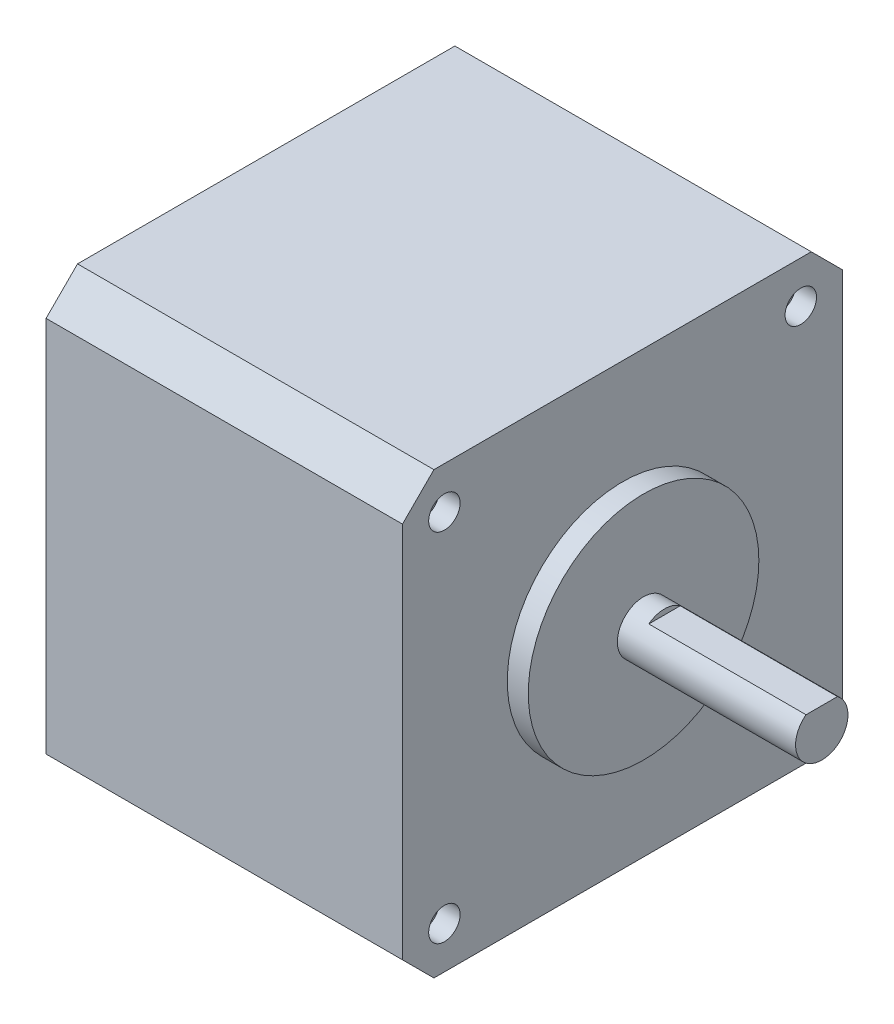
ISO-10303-21;
HEADER;
FILE_DESCRIPTION(('STEP AP214'),'2;1');
FILE_NAME('part.step','',(''),(''),'','','');
FILE_SCHEMA(('AUTOMOTIVE_DESIGN { 1 0 10303 214 1 1 1 1 }'));
ENDSEC;
DATA;
#1=APPLICATION_CONTEXT('core data for automotive mechanical design processes');
#2=APPLICATION_PROTOCOL_DEFINITION('international standard','automotive_design',2000,#1);
#3=PRODUCT_CONTEXT('',#1,'mechanical');
#4=PRODUCT('Part','Part','',(#3));
#5=PRODUCT_RELATED_PRODUCT_CATEGORY('part','',(#4));
#6=PRODUCT_DEFINITION_FORMATION('','',#4);
#7=PRODUCT_DEFINITION_CONTEXT('part definition',#1,'design');
#8=PRODUCT_DEFINITION('design','',#6,#7);
#9=PRODUCT_DEFINITION_SHAPE('','',#8);
#10=(LENGTH_UNIT() NAMED_UNIT(*) SI_UNIT(.MILLI.,.METRE.));
#11=(NAMED_UNIT(*) PLANE_ANGLE_UNIT() SI_UNIT($,.RADIAN.));
#12=(NAMED_UNIT(*) SI_UNIT($,.STERADIAN.) SOLID_ANGLE_UNIT());
#13=UNCERTAINTY_MEASURE_WITH_UNIT(LENGTH_MEASURE(1.E-05),#10,'distance_accuracy_value','');
#14=(GEOMETRIC_REPRESENTATION_CONTEXT(3) GLOBAL_UNCERTAINTY_ASSIGNED_CONTEXT((#13)) GLOBAL_UNIT_ASSIGNED_CONTEXT((#10,
#11,#12)) REPRESENTATION_CONTEXT('',''));
#15=CARTESIAN_POINT('',(0.,0.,0.));
#16=DIRECTION('',(0.,0.,1.));
#17=DIRECTION('',(1.,0.,0.));
#18=AXIS2_PLACEMENT_3D('',#15,#16,#17);
#19=CARTESIAN_POINT('',(-17.,42.,21.));
#20=DIRECTION('',(1.,0.,0.));
#21=DIRECTION('',(0.,0.,-1.));
#22=AXIS2_PLACEMENT_3D('',#19,#20,#21);
#23=PLANE('',#22);
#24=CARTESIAN_POINT('',(-17.,38.0000000000001,-17.));
#25=DIRECTION('',(1.,0.,0.));
#26=DIRECTION('',(0.,0.,-1.));
#27=AXIS2_PLACEMENT_3D('',#24,#25,#26);
#28=CIRCLE('',#27,1.5);
#29=CARTESIAN_POINT('',(-17.,38.0000000000001,-18.5));
#30=VERTEX_POINT('',#29);
#31=EDGE_CURVE('E349',#30,#30,#28,.T.);
#32=ORIENTED_EDGE('',*,*,#31,.T.);
#33=EDGE_LOOP('',(#32));
#34=FACE_BOUND('',#33,.T.);
#35=CARTESIAN_POINT('',(-17.,4.00000000000013,-17.));
#36=DIRECTION('',(1.,0.,0.));
#37=DIRECTION('',(0.,0.,-1.));
#38=AXIS2_PLACEMENT_3D('',#35,#36,#37);
#39=CIRCLE('',#38,1.5);
#40=CARTESIAN_POINT('',(-17.,4.00000000000013,-18.5));
#41=VERTEX_POINT('',#40);
#42=EDGE_CURVE('E354',#41,#41,#39,.T.);
#43=ORIENTED_EDGE('',*,*,#42,.T.);
#44=EDGE_LOOP('',(#43));
#45=FACE_BOUND('',#44,.T.);
#46=CARTESIAN_POINT('',(-17.,4.00000000000013,17.));
#47=DIRECTION('',(1.,0.,0.));
#48=DIRECTION('',(0.,0.,-1.));
#49=AXIS2_PLACEMENT_3D('',#46,#47,#48);
#50=CIRCLE('',#49,1.5);
#51=CARTESIAN_POINT('',(-17.,4.00000000000013,15.5));
#52=VERTEX_POINT('',#51);
#53=EDGE_CURVE('E360',#52,#52,#50,.T.);
#54=ORIENTED_EDGE('',*,*,#53,.T.);
#55=EDGE_LOOP('',(#54));
#56=FACE_BOUND('',#55,.T.);
#57=CARTESIAN_POINT('',(-17.,38.0000000000001,17.));
#58=DIRECTION('',(1.,0.,0.));
#59=DIRECTION('',(0.,0.,-1.));
#60=AXIS2_PLACEMENT_3D('',#57,#58,#59);
#61=CIRCLE('',#60,1.5);
#62=CARTESIAN_POINT('',(-17.,38.0000000000001,15.5));
#63=VERTEX_POINT('',#62);
#64=EDGE_CURVE('E343',#63,#63,#61,.T.);
#65=ORIENTED_EDGE('',*,*,#64,.T.);
#66=EDGE_LOOP('',(#65));
#67=FACE_BOUND('',#66,.T.);
#68=DIRECTION('',(0.,0.,1.));
#69=VECTOR('',#68,1.);
#70=CARTESIAN_POINT('',(-17.,42.,21.));
#71=LINE('',#70,#69);
#72=CARTESIAN_POINT('',(-17.,42.,-18.));
#73=VERTEX_POINT('',#72);
#74=CARTESIAN_POINT('',(-17.,42.,18.));
#75=VERTEX_POINT('',#74);
#76=EDGE_CURVE('E161',#73,#75,#71,.T.);
#77=ORIENTED_EDGE('',*,*,#76,.F.);
#78=DIRECTION('',(0.,-0.707106781186549,-0.707106781186546));
#79=VECTOR('',#78,1.);
#80=CARTESIAN_POINT('',(-17.,42.,-18.));
#81=LINE('',#80,#79);
#82=CARTESIAN_POINT('',(-17.,39.,-21.));
#83=VERTEX_POINT('',#82);
#84=EDGE_CURVE('E193',#73,#83,#81,.T.);
#85=ORIENTED_EDGE('',*,*,#84,.T.);
#86=DIRECTION('',(0.,-1.,0.));
#87=VECTOR('',#86,1.);
#88=CARTESIAN_POINT('',(-17.,42.,-21.));
#89=LINE('',#88,#87);
#90=CARTESIAN_POINT('',(-17.,3.00000000000003,-21.));
#91=VERTEX_POINT('',#90);
#92=EDGE_CURVE('E168',#83,#91,#89,.T.);
#93=ORIENTED_EDGE('',*,*,#92,.T.);
#94=DIRECTION('',(0.,0.707106781186546,-0.707106781186549));
#95=VECTOR('',#94,1.);
#96=CARTESIAN_POINT('',(-17.,3.00000000000002,-21.));
#97=LINE('',#96,#95);
#98=CARTESIAN_POINT('',(-17.,0.,-18.));
#99=VERTEX_POINT('',#98);
#100=EDGE_CURVE('E191',#91,#99,#97,.F.);
#101=ORIENTED_EDGE('',*,*,#100,.T.);
#102=DIRECTION('',(0.,0.,1.));
#103=VECTOR('',#102,1.);
#104=CARTESIAN_POINT('',(-17.,0.,21.));
#105=LINE('',#104,#103);
#106=CARTESIAN_POINT('',(-17.,0.,18.));
#107=VERTEX_POINT('',#106);
#108=EDGE_CURVE('E157',#99,#107,#105,.T.);
#109=ORIENTED_EDGE('',*,*,#108,.T.);
#110=DIRECTION('',(0.,-0.707106781186546,-0.707106781186549));
#111=VECTOR('',#110,1.);
#112=CARTESIAN_POINT('',(-17.,3.00000000000002,21.));
#113=LINE('',#112,#111);
#114=CARTESIAN_POINT('',(-17.,3.00000000000003,21.));
#115=VERTEX_POINT('',#114);
#116=EDGE_CURVE('E189',#107,#115,#113,.F.);
#117=ORIENTED_EDGE('',*,*,#116,.T.);
#118=DIRECTION('',(0.,-1.,0.));
#119=VECTOR('',#118,1.);
#120=CARTESIAN_POINT('',(-17.,42.,21.));
#121=LINE('',#120,#119);
#122=CARTESIAN_POINT('',(-17.,39.,21.));
#123=VERTEX_POINT('',#122);
#124=EDGE_CURVE('E160',#123,#115,#121,.T.);
#125=ORIENTED_EDGE('',*,*,#124,.F.);
#126=DIRECTION('',(0.,0.707106781186549,-0.707106781186546));
#127=VECTOR('',#126,1.);
#128=CARTESIAN_POINT('',(-17.,42.,18.));
#129=LINE('',#128,#127);
#130=EDGE_CURVE('E187',#123,#75,#129,.T.);
#131=ORIENTED_EDGE('',*,*,#130,.T.);
#132=EDGE_LOOP('',(#77,#85,#93,#101,#109,#117,#125,#131));
#133=FACE_BOUND('',#132,.T.);
#134=ADVANCED_FACE('F45',(#34,#45,#56,#67,#133),#23,.F.);
#135=CARTESIAN_POINT('',(17.,42.,21.));
#136=DIRECTION('',(0.,0.,-1.));
#137=DIRECTION('',(-1.,0.,0.));
#138=AXIS2_PLACEMENT_3D('',#135,#136,#137);
#139=PLANE('',#138);
#140=ORIENTED_EDGE('',*,*,#124,.T.);
#141=DIRECTION('',(1.,0.,0.));
#142=VECTOR('',#141,1.);
#143=CARTESIAN_POINT('',(17.,3.00000000000002,21.));
#144=LINE('',#143,#142);
#145=CARTESIAN_POINT('',(17.,3.00000000000003,21.));
#146=VERTEX_POINT('',#145);
#147=EDGE_CURVE('E11',#115,#146,#144,.T.);
#148=ORIENTED_EDGE('',*,*,#147,.T.);
#149=DIRECTION('',(0.,-1.,0.));
#150=VECTOR('',#149,1.);
#151=CARTESIAN_POINT('',(17.,42.,21.));
#152=LINE('',#151,#150);
#153=CARTESIAN_POINT('',(17.,39.,21.));
#154=VERTEX_POINT('',#153);
#155=EDGE_CURVE('E178',#154,#146,#152,.T.);
#156=ORIENTED_EDGE('',*,*,#155,.F.);
#157=DIRECTION('',(-1.,0.,0.));
#158=VECTOR('',#157,1.);
#159=CARTESIAN_POINT('',(-17.,39.,21.));
#160=LINE('',#159,#158);
#161=EDGE_CURVE('E54',#154,#123,#160,.T.);
#162=ORIENTED_EDGE('',*,*,#161,.T.);
#163=EDGE_LOOP('',(#140,#148,#156,#162));
#164=FACE_BOUND('',#163,.T.);
#165=ADVANCED_FACE('F212',(#164),#139,.F.);
#166=CARTESIAN_POINT('',(17.,42.,21.));
#167=DIRECTION('',(-1.,0.,0.));
#168=DIRECTION('',(0.,0.,1.));
#169=AXIS2_PLACEMENT_3D('',#166,#167,#168);
#170=PLANE('',#169);
#171=CARTESIAN_POINT('',(17.,38.0000000000001,-17.));
#172=DIRECTION('',(1.,0.,0.));
#173=DIRECTION('',(0.,0.,-1.));
#174=AXIS2_PLACEMENT_3D('',#171,#172,#173);
#175=CIRCLE('',#174,1.5);
#176=CARTESIAN_POINT('',(17.,38.0000000000001,-18.5));
#177=VERTEX_POINT('',#176);
#178=EDGE_CURVE('E309',#177,#177,#175,.T.);
#179=ORIENTED_EDGE('',*,*,#178,.F.);
#180=EDGE_LOOP('',(#179));
#181=FACE_BOUND('',#180,.T.);
#182=CARTESIAN_POINT('',(17.,4.00000000000013,-17.));
#183=DIRECTION('',(1.,0.,0.));
#184=DIRECTION('',(0.,0.,-1.));
#185=AXIS2_PLACEMENT_3D('',#182,#183,#184);
#186=CIRCLE('',#185,1.5);
#187=CARTESIAN_POINT('',(17.,4.00000000000013,-18.5));
#188=VERTEX_POINT('',#187);
#189=EDGE_CURVE('E313',#188,#188,#186,.T.);
#190=ORIENTED_EDGE('',*,*,#189,.F.);
#191=EDGE_LOOP('',(#190));
#192=FACE_BOUND('',#191,.T.);
#193=CARTESIAN_POINT('',(17.,4.00000000000013,17.));
#194=DIRECTION('',(1.,0.,0.));
#195=DIRECTION('',(0.,0.,-1.));
#196=AXIS2_PLACEMENT_3D('',#193,#194,#195);
#197=CIRCLE('',#196,1.5);
#198=CARTESIAN_POINT('',(17.,4.00000000000013,15.5));
#199=VERTEX_POINT('',#198);
#200=EDGE_CURVE('E317',#199,#199,#197,.T.);
#201=ORIENTED_EDGE('',*,*,#200,.F.);
#202=EDGE_LOOP('',(#201));
#203=FACE_BOUND('',#202,.T.);
#204=CARTESIAN_POINT('',(17.,38.0000000000001,17.));
#205=DIRECTION('',(1.,0.,0.));
#206=DIRECTION('',(0.,0.,-1.));
#207=AXIS2_PLACEMENT_3D('',#204,#205,#206);
#208=CIRCLE('',#207,1.5);
#209=CARTESIAN_POINT('',(17.,38.0000000000001,15.5));
#210=VERTEX_POINT('',#209);
#211=EDGE_CURVE('E321',#210,#210,#208,.T.);
#212=ORIENTED_EDGE('',*,*,#211,.F.);
#213=EDGE_LOOP('',(#212));
#214=FACE_BOUND('',#213,.T.);
#215=CARTESIAN_POINT('',(17.,21.0000000000001,0.));
#216=DIRECTION('',(1.,0.,0.));
#217=DIRECTION('',(0.,0.,-1.));
#218=AXIS2_PLACEMENT_3D('',#215,#216,#217);
#219=CIRCLE('',#218,11.);
#220=CARTESIAN_POINT('',(17.,21.0000000000001,-11.));
#221=VERTEX_POINT('',#220);
#222=EDGE_CURVE('E154',#221,#221,#219,.T.);
#223=ORIENTED_EDGE('',*,*,#222,.F.);
#224=EDGE_LOOP('',(#223));
#225=FACE_BOUND('',#224,.T.);
#226=DIRECTION('',(0.,-1.,0.));
#227=VECTOR('',#226,1.);
#228=CARTESIAN_POINT('',(17.,42.,-21.));
#229=LINE('',#228,#227);
#230=CARTESIAN_POINT('',(17.,39.,-21.));
#231=VERTEX_POINT('',#230);
#232=CARTESIAN_POINT('',(17.,3.00000000000003,-21.));
#233=VERTEX_POINT('',#232);
#234=EDGE_CURVE('E175',#231,#233,#229,.T.);
#235=ORIENTED_EDGE('',*,*,#234,.F.);
#236=DIRECTION('',(0.,0.707106781186549,0.707106781186546));
#237=VECTOR('',#236,1.);
#238=CARTESIAN_POINT('',(17.,42.,-18.));
#239=LINE('',#238,#237);
#240=CARTESIAN_POINT('',(17.,42.,-18.));
#241=VERTEX_POINT('',#240);
#242=EDGE_CURVE('E204',#231,#241,#239,.T.);
#243=ORIENTED_EDGE('',*,*,#242,.T.);
#244=DIRECTION('',(0.,0.,-1.));
#245=VECTOR('',#244,1.);
#246=CARTESIAN_POINT('',(17.,42.,21.));
#247=LINE('',#246,#245);
#248=CARTESIAN_POINT('',(17.,42.,18.));
#249=VERTEX_POINT('',#248);
#250=EDGE_CURVE('E164',#249,#241,#247,.T.);
#251=ORIENTED_EDGE('',*,*,#250,.F.);
#252=DIRECTION('',(0.,-0.707106781186549,0.707106781186546));
#253=VECTOR('',#252,1.);
#254=CARTESIAN_POINT('',(17.,42.,18.));
#255=LINE('',#254,#253);
#256=EDGE_CURVE('E68',#249,#154,#255,.T.);
#257=ORIENTED_EDGE('',*,*,#256,.T.);
#258=ORIENTED_EDGE('',*,*,#155,.T.);
#259=DIRECTION('',(0.,0.707106781186546,0.707106781186549));
#260=VECTOR('',#259,1.);
#261=CARTESIAN_POINT('',(17.,3.00000000000002,21.));
#262=LINE('',#261,#260);
#263=CARTESIAN_POINT('',(17.,0.,18.));
#264=VERTEX_POINT('',#263);
#265=EDGE_CURVE('E61',#146,#264,#262,.F.);
#266=ORIENTED_EDGE('',*,*,#265,.T.);
#267=DIRECTION('',(0.,0.,-1.));
#268=VECTOR('',#267,1.);
#269=CARTESIAN_POINT('',(17.,0.,21.));
#270=LINE('',#269,#268);
#271=CARTESIAN_POINT('',(17.,0.,-18.));
#272=VERTEX_POINT('',#271);
#273=EDGE_CURVE('E165',#264,#272,#270,.T.);
#274=ORIENTED_EDGE('',*,*,#273,.T.);
#275=DIRECTION('',(0.,-0.707106781186546,0.707106781186549));
#276=VECTOR('',#275,1.);
#277=CARTESIAN_POINT('',(17.,3.00000000000002,-21.));
#278=LINE('',#277,#276);
#279=EDGE_CURVE('E202',#272,#233,#278,.F.);
#280=ORIENTED_EDGE('',*,*,#279,.T.);
#281=EDGE_LOOP('',(#235,#243,#251,#257,#258,#266,#274,#280));
#282=FACE_BOUND('',#281,.T.);
#283=ADVANCED_FACE('F223',(#181,#192,#203,#214,#225,#282),#170,.F.);
#284=CARTESIAN_POINT('',(17.,42.,-21.));
#285=DIRECTION('',(0.,0.,1.));
#286=DIRECTION('',(1.,0.,0.));
#287=AXIS2_PLACEMENT_3D('',#284,#285,#286);
#288=PLANE('',#287);
#289=ORIENTED_EDGE('',*,*,#92,.F.);
#290=DIRECTION('',(1.,0.,0.));
#291=VECTOR('',#290,1.);
#292=CARTESIAN_POINT('',(17.,39.,-21.));
#293=LINE('',#292,#291);
#294=EDGE_CURVE('E198',#83,#231,#293,.T.);
#295=ORIENTED_EDGE('',*,*,#294,.T.);
#296=ORIENTED_EDGE('',*,*,#234,.T.);
#297=DIRECTION('',(-1.,0.,0.));
#298=VECTOR('',#297,1.);
#299=CARTESIAN_POINT('',(17.,3.00000000000002,-21.));
#300=LINE('',#299,#298);
#301=EDGE_CURVE('E195',#233,#91,#300,.T.);
#302=ORIENTED_EDGE('',*,*,#301,.T.);
#303=EDGE_LOOP('',(#289,#295,#296,#302));
#304=FACE_BOUND('',#303,.T.);
#305=ADVANCED_FACE('F230',(#304),#288,.F.);
#306=CARTESIAN_POINT('',(0.,42.,0.));
#307=DIRECTION('',(0.,1.,0.));
#308=DIRECTION('',(0.,0.,1.));
#309=AXIS2_PLACEMENT_3D('',#306,#307,#308);
#310=PLANE('',#309);
#311=ORIENTED_EDGE('',*,*,#250,.T.);
#312=DIRECTION('',(-1.,0.,0.));
#313=VECTOR('',#312,1.);
#314=CARTESIAN_POINT('',(-17.,42.,-18.));
#315=LINE('',#314,#313);
#316=EDGE_CURVE('E184',#241,#73,#315,.T.);
#317=ORIENTED_EDGE('',*,*,#316,.T.);
#318=ORIENTED_EDGE('',*,*,#76,.T.);
#319=DIRECTION('',(1.,0.,0.));
#320=VECTOR('',#319,1.);
#321=CARTESIAN_POINT('',(17.,42.,18.));
#322=LINE('',#321,#320);
#323=EDGE_CURVE('E153',#75,#249,#322,.T.);
#324=ORIENTED_EDGE('',*,*,#323,.T.);
#325=EDGE_LOOP('',(#311,#317,#318,#324));
#326=FACE_BOUND('',#325,.T.);
#327=ADVANCED_FACE('F220',(#326),#310,.T.);
#328=CARTESIAN_POINT('',(0.,0.,0.));
#329=DIRECTION('',(0.,1.,0.));
#330=DIRECTION('',(0.,0.,1.));
#331=AXIS2_PLACEMENT_3D('',#328,#329,#330);
#332=PLANE('',#331);
#333=ORIENTED_EDGE('',*,*,#108,.F.);
#334=DIRECTION('',(1.,0.,0.));
#335=VECTOR('',#334,1.);
#336=CARTESIAN_POINT('',(0.,0.,-18.));
#337=LINE('',#336,#335);
#338=EDGE_CURVE('E208',#99,#272,#337,.T.);
#339=ORIENTED_EDGE('',*,*,#338,.T.);
#340=ORIENTED_EDGE('',*,*,#273,.F.);
#341=DIRECTION('',(-1.,0.,0.));
#342=VECTOR('',#341,1.);
#343=CARTESIAN_POINT('',(0.,0.,18.));
#344=LINE('',#343,#342);
#345=EDGE_CURVE('E206',#264,#107,#344,.T.);
#346=ORIENTED_EDGE('',*,*,#345,.T.);
#347=EDGE_LOOP('',(#333,#339,#340,#346));
#348=FACE_BOUND('',#347,.T.);
#349=ADVANCED_FACE('F238',(#348),#332,.F.);
#350=CARTESIAN_POINT('',(19.,21.0000000000001,0.));
#351=DIRECTION('',(-1.,0.,0.));
#352=DIRECTION('',(0.,0.,1.));
#353=AXIS2_PLACEMENT_3D('',#350,#351,#352);
#354=CYLINDRICAL_SURFACE('',#353,11.);
#355=CARTESIAN_POINT('',(19.,21.0000000000001,0.));
#356=DIRECTION('',(1.,0.,0.));
#357=DIRECTION('',(0.,0.,-1.));
#358=AXIS2_PLACEMENT_3D('',#355,#356,#357);
#359=CIRCLE('',#358,11.);
#360=CARTESIAN_POINT('',(19.,21.0000000000001,-11.));
#361=VERTEX_POINT('',#360);
#362=EDGE_CURVE('E145',#361,#361,#359,.T.);
#363=ORIENTED_EDGE('',*,*,#362,.F.);
#364=EDGE_LOOP('',(#363));
#365=FACE_BOUND('',#364,.T.);
#366=ORIENTED_EDGE('',*,*,#222,.T.);
#367=EDGE_LOOP('',(#366));
#368=FACE_BOUND('',#367,.T.);
#369=ADVANCED_FACE('F293',(#365,#368),#354,.T.);
#370=CARTESIAN_POINT('',(19.,21.0000000000001,0.));
#371=DIRECTION('',(1.,0.,0.));
#372=DIRECTION('',(0.,0.,-1.));
#373=AXIS2_PLACEMENT_3D('',#370,#371,#372);
#374=PLANE('',#373);
#375=CARTESIAN_POINT('',(19.,21.0000000000001,0.));
#376=DIRECTION('',(1.,0.,0.));
#377=DIRECTION('',(0.,0.,-1.));
#378=AXIS2_PLACEMENT_3D('',#375,#376,#377);
#379=CIRCLE('',#378,2.5);
#380=CARTESIAN_POINT('',(19.,21.0000000000001,-2.5));
#381=VERTEX_POINT('',#380);
#382=EDGE_CURVE('E150',#381,#381,#379,.T.);
#383=ORIENTED_EDGE('',*,*,#382,.F.);
#384=EDGE_LOOP('',(#383));
#385=FACE_BOUND('',#384,.T.);
#386=ORIENTED_EDGE('',*,*,#362,.T.);
#387=EDGE_LOOP('',(#386));
#388=FACE_BOUND('',#387,.T.);
#389=ADVANCED_FACE('F290',(#385,#388),#374,.T.);
#390=CARTESIAN_POINT('',(21.,21.0000000000001,0.));
#391=DIRECTION('',(-1.,0.,0.));
#392=DIRECTION('',(0.,0.,1.));
#393=AXIS2_PLACEMENT_3D('',#390,#391,#392);
#394=CYLINDRICAL_SURFACE('',#393,2.5);
#395=CARTESIAN_POINT('',(21.,21.0000000000001,0.));
#396=DIRECTION('',(1.,0.,0.));
#397=DIRECTION('',(0.,0.,-1.));
#398=AXIS2_PLACEMENT_3D('',#395,#396,#397);
#399=CIRCLE('',#398,2.5);
#400=CARTESIAN_POINT('',(21.,23.0000000000001,-1.5));
#401=VERTEX_POINT('',#400);
#402=CARTESIAN_POINT('',(21.,23.0000000000001,1.5));
#403=VERTEX_POINT('',#402);
#404=EDGE_CURVE('E143',#401,#403,#399,.T.);
#405=ORIENTED_EDGE('',*,*,#404,.F.);
#406=DIRECTION('',(-1.,0.,0.));
#407=VECTOR('',#406,1.);
#408=CARTESIAN_POINT('',(36.,23.0000000000001,-1.5));
#409=LINE('',#408,#407);
#410=CARTESIAN_POINT('',(36.,23.0000000000001,-1.5));
#411=VERTEX_POINT('',#410);
#412=EDGE_CURVE('E129',#411,#401,#409,.T.);
#413=ORIENTED_EDGE('',*,*,#412,.F.);
#414=CARTESIAN_POINT('',(36.,21.0000000000001,0.));
#415=DIRECTION('',(1.,0.,0.));
#416=DIRECTION('',(0.,0.,-1.));
#417=AXIS2_PLACEMENT_3D('',#414,#415,#416);
#418=CIRCLE('',#417,2.5);
#419=CARTESIAN_POINT('',(36.,23.0000000000001,1.5));
#420=VERTEX_POINT('',#419);
#421=EDGE_CURVE('E134',#420,#411,#418,.T.);
#422=ORIENTED_EDGE('',*,*,#421,.F.);
#423=DIRECTION('',(-1.,0.,0.));
#424=VECTOR('',#423,1.);
#425=CARTESIAN_POINT('',(36.,23.0000000000001,1.5));
#426=LINE('',#425,#424);
#427=EDGE_CURVE('E131',#420,#403,#426,.T.);
#428=ORIENTED_EDGE('',*,*,#427,.T.);
#429=EDGE_LOOP('',(#405,#413,#422,#428));
#430=FACE_BOUND('',#429,.T.);
#431=ORIENTED_EDGE('',*,*,#382,.T.);
#432=EDGE_LOOP('',(#431));
#433=FACE_BOUND('',#432,.T.);
#434=ADVANCED_FACE('F141',(#430,#433),#394,.T.);
#435=CARTESIAN_POINT('',(21.,21.0000000000001,0.));
#436=DIRECTION('',(1.,0.,0.));
#437=DIRECTION('',(0.,0.,-1.));
#438=AXIS2_PLACEMENT_3D('',#435,#436,#437);
#439=PLANE('',#438);
#440=DIRECTION('',(0.,0.,1.));
#441=VECTOR('',#440,1.);
#442=CARTESIAN_POINT('',(21.,23.0000000000001,-1.5));
#443=LINE('',#442,#441);
#444=EDGE_CURVE('E138',#401,#403,#443,.T.);
#445=ORIENTED_EDGE('',*,*,#444,.F.);
#446=ORIENTED_EDGE('',*,*,#404,.T.);
#447=EDGE_LOOP('',(#445,#446));
#448=FACE_BOUND('',#447,.T.);
#449=ADVANCED_FACE('F280',(#448),#439,.T.);
#450=CARTESIAN_POINT('',(36.,23.0000000000001,-1.5));
#451=DIRECTION('',(0.,-1.,0.));
#452=DIRECTION('',(0.,0.,-1.));
#453=AXIS2_PLACEMENT_3D('',#450,#451,#452);
#454=PLANE('',#453);
#455=ORIENTED_EDGE('',*,*,#444,.T.);
#456=ORIENTED_EDGE('',*,*,#427,.F.);
#457=DIRECTION('',(0.,0.,1.));
#458=VECTOR('',#457,1.);
#459=CARTESIAN_POINT('',(36.,23.0000000000001,-1.5));
#460=LINE('',#459,#458);
#461=EDGE_CURVE('E124',#411,#420,#460,.T.);
#462=ORIENTED_EDGE('',*,*,#461,.F.);
#463=ORIENTED_EDGE('',*,*,#412,.T.);
#464=EDGE_LOOP('',(#455,#456,#462,#463));
#465=FACE_BOUND('',#464,.T.);
#466=ADVANCED_FACE('F127',(#465),#454,.F.);
#467=CARTESIAN_POINT('',(36.,21.0000000000001,0.));
#468=DIRECTION('',(1.,0.,0.));
#469=DIRECTION('',(0.,0.,-1.));
#470=AXIS2_PLACEMENT_3D('',#467,#468,#469);
#471=PLANE('',#470);
#472=ORIENTED_EDGE('',*,*,#421,.T.);
#473=ORIENTED_EDGE('',*,*,#461,.T.);
#474=EDGE_LOOP('',(#472,#473));
#475=FACE_BOUND('',#474,.T.);
#476=ADVANCED_FACE('F136',(#475),#471,.T.);
#477=CARTESIAN_POINT('',(0.,42.,-18.));
#478=DIRECTION('',(0.,0.707106781186546,-0.707106781186549));
#479=DIRECTION('',(1.,0.,0.));
#480=AXIS2_PLACEMENT_3D('',#477,#478,#479);
#481=PLANE('',#480);
#482=ORIENTED_EDGE('',*,*,#242,.F.);
#483=ORIENTED_EDGE('',*,*,#294,.F.);
#484=ORIENTED_EDGE('',*,*,#84,.F.);
#485=ORIENTED_EDGE('',*,*,#316,.F.);
#486=EDGE_LOOP('',(#482,#483,#484,#485));
#487=FACE_BOUND('',#486,.T.);
#488=ADVANCED_FACE('F227',(#487),#481,.T.);
#489=CARTESIAN_POINT('',(17.,3.00000000000002,-21.));
#490=DIRECTION('',(0.,0.707106781186549,0.707106781186546));
#491=DIRECTION('',(-1.,0.,0.));
#492=AXIS2_PLACEMENT_3D('',#489,#490,#491);
#493=PLANE('',#492);
#494=ORIENTED_EDGE('',*,*,#279,.F.);
#495=ORIENTED_EDGE('',*,*,#338,.F.);
#496=ORIENTED_EDGE('',*,*,#100,.F.);
#497=ORIENTED_EDGE('',*,*,#301,.F.);
#498=EDGE_LOOP('',(#494,#495,#496,#497));
#499=FACE_BOUND('',#498,.T.);
#500=ADVANCED_FACE('F234',(#499),#493,.F.);
#501=CARTESIAN_POINT('',(17.,3.00000000000002,21.));
#502=DIRECTION('',(0.,0.707106781186549,-0.707106781186546));
#503=DIRECTION('',(1.,0.,0.));
#504=AXIS2_PLACEMENT_3D('',#501,#502,#503);
#505=PLANE('',#504);
#506=ORIENTED_EDGE('',*,*,#116,.F.);
#507=ORIENTED_EDGE('',*,*,#345,.F.);
#508=ORIENTED_EDGE('',*,*,#265,.F.);
#509=ORIENTED_EDGE('',*,*,#147,.F.);
#510=EDGE_LOOP('',(#506,#507,#508,#509));
#511=FACE_BOUND('',#510,.T.);
#512=ADVANCED_FACE('F240',(#511),#505,.F.);
#513=CARTESIAN_POINT('',(0.,42.,18.));
#514=DIRECTION('',(0.,0.707106781186546,0.707106781186549));
#515=DIRECTION('',(-1.,0.,0.));
#516=AXIS2_PLACEMENT_3D('',#513,#514,#515);
#517=PLANE('',#516);
#518=ORIENTED_EDGE('',*,*,#130,.F.);
#519=ORIENTED_EDGE('',*,*,#161,.F.);
#520=ORIENTED_EDGE('',*,*,#256,.F.);
#521=ORIENTED_EDGE('',*,*,#323,.F.);
#522=EDGE_LOOP('',(#518,#519,#520,#521));
#523=FACE_BOUND('',#522,.T.);
#524=ADVANCED_FACE('F48',(#523),#517,.T.);
#525=CARTESIAN_POINT('',(15.,38.0000000000001,17.));
#526=DIRECTION('',(1.,0.,0.));
#527=DIRECTION('',(0.,0.,-1.));
#528=AXIS2_PLACEMENT_3D('',#525,#526,#527);
#529=CYLINDRICAL_SURFACE('',#528,1.5);
#530=CARTESIAN_POINT('',(15.,38.0000000000001,17.));
#531=DIRECTION('',(1.,0.,0.));
#532=DIRECTION('',(0.,0.,-1.));
#533=AXIS2_PLACEMENT_3D('',#530,#531,#532);
#534=CIRCLE('',#533,1.5);
#535=CARTESIAN_POINT('',(15.,38.0000000000001,15.5));
#536=VERTEX_POINT('',#535);
#537=EDGE_CURVE('E325',#536,#536,#534,.T.);
#538=ORIENTED_EDGE('',*,*,#537,.F.);
#539=EDGE_LOOP('',(#538));
#540=FACE_BOUND('',#539,.T.);
#541=ORIENTED_EDGE('',*,*,#211,.T.);
#542=EDGE_LOOP('',(#541));
#543=FACE_BOUND('',#542,.T.);
#544=ADVANCED_FACE('F246',(#540,#543),#529,.F.);
#545=CARTESIAN_POINT('',(15.,38.0000000000001,17.));
#546=DIRECTION('',(1.,0.,0.));
#547=DIRECTION('',(0.,0.,-1.));
#548=AXIS2_PLACEMENT_3D('',#545,#546,#547);
#549=PLANE('',#548);
#550=ORIENTED_EDGE('',*,*,#537,.T.);
#551=EDGE_LOOP('',(#550));
#552=FACE_BOUND('',#551,.T.);
#553=ADVANCED_FACE('F406',(#552),#549,.T.);
#554=CARTESIAN_POINT('',(15.,4.00000000000013,17.));
#555=DIRECTION('',(1.,0.,0.));
#556=DIRECTION('',(0.,0.,-1.));
#557=AXIS2_PLACEMENT_3D('',#554,#555,#556);
#558=CYLINDRICAL_SURFACE('',#557,1.5);
#559=CARTESIAN_POINT('',(15.,4.00000000000013,17.));
#560=DIRECTION('',(1.,0.,0.));
#561=DIRECTION('',(0.,0.,-1.));
#562=AXIS2_PLACEMENT_3D('',#559,#560,#561);
#563=CIRCLE('',#562,1.5);
#564=CARTESIAN_POINT('',(15.,4.00000000000013,15.5));
#565=VERTEX_POINT('',#564);
#566=EDGE_CURVE('E329',#565,#565,#563,.T.);
#567=ORIENTED_EDGE('',*,*,#566,.F.);
#568=EDGE_LOOP('',(#567));
#569=FACE_BOUND('',#568,.T.);
#570=ORIENTED_EDGE('',*,*,#200,.T.);
#571=EDGE_LOOP('',(#570));
#572=FACE_BOUND('',#571,.T.);
#573=ADVANCED_FACE('F402',(#569,#572),#558,.F.);
#574=CARTESIAN_POINT('',(15.,4.00000000000013,17.));
#575=DIRECTION('',(1.,0.,0.));
#576=DIRECTION('',(0.,0.,-1.));
#577=AXIS2_PLACEMENT_3D('',#574,#575,#576);
#578=PLANE('',#577);
#579=ORIENTED_EDGE('',*,*,#566,.T.);
#580=EDGE_LOOP('',(#579));
#581=FACE_BOUND('',#580,.T.);
#582=ADVANCED_FACE('F405',(#581),#578,.T.);
#583=CARTESIAN_POINT('',(15.,4.00000000000013,-17.));
#584=DIRECTION('',(1.,0.,0.));
#585=DIRECTION('',(0.,0.,-1.));
#586=AXIS2_PLACEMENT_3D('',#583,#584,#585);
#587=CYLINDRICAL_SURFACE('',#586,1.5);
#588=CARTESIAN_POINT('',(15.,4.00000000000013,-17.));
#589=DIRECTION('',(1.,0.,0.));
#590=DIRECTION('',(0.,0.,-1.));
#591=AXIS2_PLACEMENT_3D('',#588,#589,#590);
#592=CIRCLE('',#591,1.5);
#593=CARTESIAN_POINT('',(15.,4.00000000000013,-18.5));
#594=VERTEX_POINT('',#593);
#595=EDGE_CURVE('E337',#594,#594,#592,.T.);
#596=ORIENTED_EDGE('',*,*,#595,.F.);
#597=EDGE_LOOP('',(#596));
#598=FACE_BOUND('',#597,.T.);
#599=ORIENTED_EDGE('',*,*,#189,.T.);
#600=EDGE_LOOP('',(#599));
#601=FACE_BOUND('',#600,.T.);
#602=ADVANCED_FACE('F410',(#598,#601),#587,.F.);
#603=CARTESIAN_POINT('',(15.,4.00000000000013,-17.));
#604=DIRECTION('',(1.,0.,0.));
#605=DIRECTION('',(0.,0.,-1.));
#606=AXIS2_PLACEMENT_3D('',#603,#604,#605);
#607=PLANE('',#606);
#608=ORIENTED_EDGE('',*,*,#595,.T.);
#609=EDGE_LOOP('',(#608));
#610=FACE_BOUND('',#609,.T.);
#611=ADVANCED_FACE('F414',(#610),#607,.T.);
#612=CARTESIAN_POINT('',(15.,38.0000000000001,-17.));
#613=DIRECTION('',(1.,0.,0.));
#614=DIRECTION('',(0.,0.,-1.));
#615=AXIS2_PLACEMENT_3D('',#612,#613,#614);
#616=CYLINDRICAL_SURFACE('',#615,1.5);
#617=CARTESIAN_POINT('',(15.,38.0000000000001,-17.));
#618=DIRECTION('',(1.,0.,0.));
#619=DIRECTION('',(0.,0.,-1.));
#620=AXIS2_PLACEMENT_3D('',#617,#618,#619);
#621=CIRCLE('',#620,1.5);
#622=CARTESIAN_POINT('',(15.,38.0000000000001,-18.5));
#623=VERTEX_POINT('',#622);
#624=EDGE_CURVE('E332',#623,#623,#621,.T.);
#625=ORIENTED_EDGE('',*,*,#624,.F.);
#626=EDGE_LOOP('',(#625));
#627=FACE_BOUND('',#626,.T.);
#628=ORIENTED_EDGE('',*,*,#178,.T.);
#629=EDGE_LOOP('',(#628));
#630=FACE_BOUND('',#629,.T.);
#631=ADVANCED_FACE('F418',(#627,#630),#616,.F.);
#632=CARTESIAN_POINT('',(15.,38.0000000000001,-17.));
#633=DIRECTION('',(1.,0.,0.));
#634=DIRECTION('',(0.,0.,-1.));
#635=AXIS2_PLACEMENT_3D('',#632,#633,#634);
#636=PLANE('',#635);
#637=ORIENTED_EDGE('',*,*,#624,.T.);
#638=EDGE_LOOP('',(#637));
#639=FACE_BOUND('',#638,.T.);
#640=ADVANCED_FACE('F400',(#639),#636,.T.);
#641=CARTESIAN_POINT('',(-15.,38.0000000000001,17.));
#642=DIRECTION('',(-1.,0.,0.));
#643=DIRECTION('',(0.,0.,1.));
#644=AXIS2_PLACEMENT_3D('',#641,#642,#643);
#645=CYLINDRICAL_SURFACE('',#644,1.5);
#646=CARTESIAN_POINT('',(-15.,38.0000000000001,17.));
#647=DIRECTION('',(1.,0.,0.));
#648=DIRECTION('',(0.,0.,-1.));
#649=AXIS2_PLACEMENT_3D('',#646,#647,#648);
#650=CIRCLE('',#649,1.5);
#651=CARTESIAN_POINT('',(-15.,38.0000000000001,15.5));
#652=VERTEX_POINT('',#651);
#653=EDGE_CURVE('E335',#652,#652,#650,.T.);
#654=ORIENTED_EDGE('',*,*,#653,.T.);
#655=EDGE_LOOP('',(#654));
#656=FACE_BOUND('',#655,.T.);
#657=ORIENTED_EDGE('',*,*,#64,.F.);
#658=EDGE_LOOP('',(#657));
#659=FACE_BOUND('',#658,.T.);
#660=ADVANCED_FACE('F396',(#656,#659),#645,.F.);
#661=CARTESIAN_POINT('',(-15.,38.0000000000001,17.));
#662=DIRECTION('',(-1.,0.,0.));
#663=DIRECTION('',(0.,0.,-1.));
#664=AXIS2_PLACEMENT_3D('',#661,#662,#663);
#665=PLANE('',#664);
#666=ORIENTED_EDGE('',*,*,#653,.F.);
#667=EDGE_LOOP('',(#666));
#668=FACE_BOUND('',#667,.T.);
#669=ADVANCED_FACE('F380',(#668),#665,.T.);
#670=CARTESIAN_POINT('',(-15.,4.00000000000013,17.));
#671=DIRECTION('',(-1.,0.,0.));
#672=DIRECTION('',(0.,0.,1.));
#673=AXIS2_PLACEMENT_3D('',#670,#671,#672);
#674=CYLINDRICAL_SURFACE('',#673,1.5);
#675=CARTESIAN_POINT('',(-15.,4.00000000000013,17.));
#676=DIRECTION('',(1.,0.,0.));
#677=DIRECTION('',(0.,0.,-1.));
#678=AXIS2_PLACEMENT_3D('',#675,#676,#677);
#679=CIRCLE('',#678,1.5);
#680=CARTESIAN_POINT('',(-15.,4.00000000000013,15.5));
#681=VERTEX_POINT('',#680);
#682=EDGE_CURVE('E346',#681,#681,#679,.T.);
#683=ORIENTED_EDGE('',*,*,#682,.T.);
#684=EDGE_LOOP('',(#683));
#685=FACE_BOUND('',#684,.T.);
#686=ORIENTED_EDGE('',*,*,#53,.F.);
#687=EDGE_LOOP('',(#686));
#688=FACE_BOUND('',#687,.T.);
#689=ADVANCED_FACE('F366',(#685,#688),#674,.F.);
#690=CARTESIAN_POINT('',(-15.,4.00000000000013,17.));
#691=DIRECTION('',(-1.,0.,0.));
#692=DIRECTION('',(0.,0.,-1.));
#693=AXIS2_PLACEMENT_3D('',#690,#691,#692);
#694=PLANE('',#693);
#695=ORIENTED_EDGE('',*,*,#682,.F.);
#696=EDGE_LOOP('',(#695));
#697=FACE_BOUND('',#696,.T.);
#698=ADVANCED_FACE('F369',(#697),#694,.T.);
#699=CARTESIAN_POINT('',(-15.,4.00000000000013,-17.));
#700=DIRECTION('',(-1.,0.,0.));
#701=DIRECTION('',(0.,0.,1.));
#702=AXIS2_PLACEMENT_3D('',#699,#700,#701);
#703=CYLINDRICAL_SURFACE('',#702,1.5);
#704=CARTESIAN_POINT('',(-15.,4.00000000000013,-17.));
#705=DIRECTION('',(1.,0.,0.));
#706=DIRECTION('',(0.,0.,-1.));
#707=AXIS2_PLACEMENT_3D('',#704,#705,#706);
#708=CIRCLE('',#707,1.5);
#709=CARTESIAN_POINT('',(-15.,4.00000000000013,-18.5));
#710=VERTEX_POINT('',#709);
#711=EDGE_CURVE('E357',#710,#710,#708,.T.);
#712=ORIENTED_EDGE('',*,*,#711,.T.);
#713=EDGE_LOOP('',(#712));
#714=FACE_BOUND('',#713,.T.);
#715=ORIENTED_EDGE('',*,*,#42,.F.);
#716=EDGE_LOOP('',(#715));
#717=FACE_BOUND('',#716,.T.);
#718=ADVANCED_FACE('F371',(#714,#717),#703,.F.);
#719=CARTESIAN_POINT('',(-15.,4.00000000000013,-17.));
#720=DIRECTION('',(-1.,0.,0.));
#721=DIRECTION('',(0.,0.,-1.));
#722=AXIS2_PLACEMENT_3D('',#719,#720,#721);
#723=PLANE('',#722);
#724=ORIENTED_EDGE('',*,*,#711,.F.);
#725=EDGE_LOOP('',(#724));
#726=FACE_BOUND('',#725,.T.);
#727=ADVANCED_FACE('F377',(#726),#723,.T.);
#728=CARTESIAN_POINT('',(-15.,38.0000000000001,-17.));
#729=DIRECTION('',(-1.,0.,0.));
#730=DIRECTION('',(0.,0.,1.));
#731=AXIS2_PLACEMENT_3D('',#728,#729,#730);
#732=CYLINDRICAL_SURFACE('',#731,1.5);
#733=CARTESIAN_POINT('',(-15.,38.0000000000001,-17.));
#734=DIRECTION('',(1.,0.,0.));
#735=DIRECTION('',(0.,0.,-1.));
#736=AXIS2_PLACEMENT_3D('',#733,#734,#735);
#737=CIRCLE('',#736,1.5);
#738=CARTESIAN_POINT('',(-15.,38.0000000000001,-18.5));
#739=VERTEX_POINT('',#738);
#740=EDGE_CURVE('E351',#739,#739,#737,.T.);
#741=ORIENTED_EDGE('',*,*,#740,.T.);
#742=EDGE_LOOP('',(#741));
#743=FACE_BOUND('',#742,.T.);
#744=ORIENTED_EDGE('',*,*,#31,.F.);
#745=EDGE_LOOP('',(#744));
#746=FACE_BOUND('',#745,.T.);
#747=ADVANCED_FACE('F384',(#743,#746),#732,.F.);
#748=CARTESIAN_POINT('',(-15.,38.0000000000001,-17.));
#749=DIRECTION('',(-1.,0.,0.));
#750=DIRECTION('',(0.,0.,-1.));
#751=AXIS2_PLACEMENT_3D('',#748,#749,#750);
#752=PLANE('',#751);
#753=ORIENTED_EDGE('',*,*,#740,.F.);
#754=EDGE_LOOP('',(#753));
#755=FACE_BOUND('',#754,.T.);
#756=ADVANCED_FACE('F387',(#755),#752,.T.);
#757=CLOSED_SHELL('',(#134,#165,#283,#305,#327,#349,#369,#389,#434,#449,#466,#476,#488,#500,
#512,#524,#544,#553,#573,#582,#602,#611,#631,#640,#660,#669,#689,#698,#718,#727,#747,#756));
#758=MANIFOLD_SOLID_BREP('B2',#757);
#759=ADVANCED_BREP_SHAPE_REPRESENTATION('',(#18,#758),#14);
#760=SHAPE_DEFINITION_REPRESENTATION(#9,#759);
ENDSEC;
END-ISO-10303-21;
